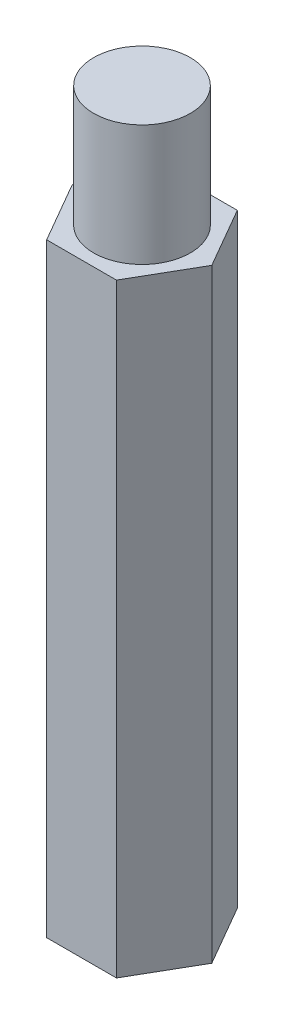
ISO-10303-21;
HEADER;
FILE_DESCRIPTION(('STEP AP214'),'2;1');
FILE_NAME('part.step','',(''),(''),'','','');
FILE_SCHEMA(('AUTOMOTIVE_DESIGN { 1 0 10303 214 1 1 1 1 }'));
ENDSEC;
DATA;
#1=APPLICATION_CONTEXT('core data for automotive mechanical design processes');
#2=APPLICATION_PROTOCOL_DEFINITION('international standard','automotive_design',2000,#1);
#3=PRODUCT_CONTEXT('',#1,'mechanical');
#4=PRODUCT('Part','Part','',(#3));
#5=PRODUCT_RELATED_PRODUCT_CATEGORY('part','',(#4));
#6=PRODUCT_DEFINITION_FORMATION('','',#4);
#7=PRODUCT_DEFINITION_CONTEXT('part definition',#1,'design');
#8=PRODUCT_DEFINITION('design','',#6,#7);
#9=PRODUCT_DEFINITION_SHAPE('','',#8);
#10=(LENGTH_UNIT() NAMED_UNIT(*) SI_UNIT(.MILLI.,.METRE.));
#11=(NAMED_UNIT(*) PLANE_ANGLE_UNIT() SI_UNIT($,.RADIAN.));
#12=(NAMED_UNIT(*) SI_UNIT($,.STERADIAN.) SOLID_ANGLE_UNIT());
#13=UNCERTAINTY_MEASURE_WITH_UNIT(LENGTH_MEASURE(1.E-05),#10,'distance_accuracy_value','');
#14=(GEOMETRIC_REPRESENTATION_CONTEXT(3) GLOBAL_UNCERTAINTY_ASSIGNED_CONTEXT((#13)) GLOBAL_UNIT_ASSIGNED_CONTEXT((#10,
#11,#12)) REPRESENTATION_CONTEXT('',''));
#15=CARTESIAN_POINT('',(0.,0.,0.));
#16=DIRECTION('',(0.,0.,1.));
#17=DIRECTION('',(1.,0.,0.));
#18=AXIS2_PLACEMENT_3D('',#15,#16,#17);
#19=CARTESIAN_POINT('',(2.3094010767585,20.,0.));
#20=DIRECTION('',(-0.866025403784438,0.,0.5));
#21=DIRECTION('',(0.5,0.,0.866025403784439));
#22=AXIS2_PLACEMENT_3D('',#19,#20,#21);
#23=PLANE('',#22);
#24=DIRECTION('',(-0.5,0.,-0.866025403784439));
#25=VECTOR('',#24,1.);
#26=CARTESIAN_POINT('',(2.3094010767585,0.,0.));
#27=LINE('',#26,#25);
#28=CARTESIAN_POINT('',(2.3094010767585,0.,0.));
#29=VERTEX_POINT('',#28);
#30=CARTESIAN_POINT('',(1.15470053837925,0.,-2.));
#31=VERTEX_POINT('',#30);
#32=EDGE_CURVE('E130',#29,#31,#27,.T.);
#33=ORIENTED_EDGE('',*,*,#32,.T.);
#34=DIRECTION('',(0.,-1.,0.));
#35=VECTOR('',#34,1.);
#36=CARTESIAN_POINT('',(1.15470053837925,20.,-2.));
#37=LINE('',#36,#35);
#38=CARTESIAN_POINT('',(1.15470053837925,20.,-2.));
#39=VERTEX_POINT('',#38);
#40=EDGE_CURVE('E42',#39,#31,#37,.T.);
#41=ORIENTED_EDGE('',*,*,#40,.F.);
#42=DIRECTION('',(-0.5,0.,-0.866025403784439));
#43=VECTOR('',#42,1.);
#44=CARTESIAN_POINT('',(2.3094010767585,20.,0.));
#45=LINE('',#44,#43);
#46=CARTESIAN_POINT('',(2.3094010767585,20.,0.));
#47=VERTEX_POINT('',#46);
#48=EDGE_CURVE('E147',#47,#39,#45,.T.);
#49=ORIENTED_EDGE('',*,*,#48,.F.);
#50=DIRECTION('',(0.,-1.,0.));
#51=VECTOR('',#50,1.);
#52=CARTESIAN_POINT('',(2.3094010767585,20.,0.));
#53=LINE('',#52,#51);
#54=EDGE_CURVE('E126',#47,#29,#53,.T.);
#55=ORIENTED_EDGE('',*,*,#54,.T.);
#56=EDGE_LOOP('',(#33,#41,#49,#55));
#57=FACE_BOUND('',#56,.T.);
#58=ADVANCED_FACE('F39',(#57),#23,.F.);
#59=CARTESIAN_POINT('',(1.15470053837925,20.,-2.));
#60=DIRECTION('',(0.,0.,1.));
#61=DIRECTION('',(1.,0.,0.));
#62=AXIS2_PLACEMENT_3D('',#59,#60,#61);
#63=PLANE('',#62);
#64=DIRECTION('',(-1.,0.,0.));
#65=VECTOR('',#64,1.);
#66=CARTESIAN_POINT('',(1.15470053837925,0.,-2.));
#67=LINE('',#66,#65);
#68=CARTESIAN_POINT('',(-1.15470053837925,0.,-2.));
#69=VERTEX_POINT('',#68);
#70=EDGE_CURVE('E134',#31,#69,#67,.T.);
#71=ORIENTED_EDGE('',*,*,#70,.T.);
#72=DIRECTION('',(0.,-1.,0.));
#73=VECTOR('',#72,1.);
#74=CARTESIAN_POINT('',(-1.15470053837925,20.,-2.));
#75=LINE('',#74,#73);
#76=CARTESIAN_POINT('',(-1.15470053837925,20.,-2.));
#77=VERTEX_POINT('',#76);
#78=EDGE_CURVE('E153',#77,#69,#75,.T.);
#79=ORIENTED_EDGE('',*,*,#78,.F.);
#80=DIRECTION('',(-1.,0.,0.));
#81=VECTOR('',#80,1.);
#82=CARTESIAN_POINT('',(1.15470053837925,20.,-2.));
#83=LINE('',#82,#81);
#84=EDGE_CURVE('E95',#39,#77,#83,.T.);
#85=ORIENTED_EDGE('',*,*,#84,.F.);
#86=ORIENTED_EDGE('',*,*,#40,.T.);
#87=EDGE_LOOP('',(#71,#79,#85,#86));
#88=FACE_BOUND('',#87,.T.);
#89=ADVANCED_FACE('F160',(#88),#63,.F.);
#90=CARTESIAN_POINT('',(-1.15470053837925,20.,-2.));
#91=DIRECTION('',(0.866025403784439,0.,0.5));
#92=DIRECTION('',(0.5,0.,-0.866025403784439));
#93=AXIS2_PLACEMENT_3D('',#90,#91,#92);
#94=PLANE('',#93);
#95=DIRECTION('',(-0.499999999999999,0.,0.866025403784439));
#96=VECTOR('',#95,1.);
#97=CARTESIAN_POINT('',(-1.15470053837925,0.,-2.));
#98=LINE('',#97,#96);
#99=CARTESIAN_POINT('',(-2.3094010767585,0.,0.));
#100=VERTEX_POINT('',#99);
#101=EDGE_CURVE('E138',#69,#100,#98,.T.);
#102=ORIENTED_EDGE('',*,*,#101,.T.);
#103=DIRECTION('',(0.,-1.,0.));
#104=VECTOR('',#103,1.);
#105=CARTESIAN_POINT('',(-2.3094010767585,20.,0.));
#106=LINE('',#105,#104);
#107=CARTESIAN_POINT('',(-2.3094010767585,20.,0.));
#108=VERTEX_POINT('',#107);
#109=EDGE_CURVE('E119',#108,#100,#106,.T.);
#110=ORIENTED_EDGE('',*,*,#109,.F.);
#111=DIRECTION('',(-0.499999999999999,0.,0.866025403784439));
#112=VECTOR('',#111,1.);
#113=CARTESIAN_POINT('',(-1.15470053837925,20.,-2.));
#114=LINE('',#113,#112);
#115=EDGE_CURVE('E108',#77,#108,#114,.T.);
#116=ORIENTED_EDGE('',*,*,#115,.F.);
#117=ORIENTED_EDGE('',*,*,#78,.T.);
#118=EDGE_LOOP('',(#102,#110,#116,#117));
#119=FACE_BOUND('',#118,.T.);
#120=ADVANCED_FACE('F166',(#119),#94,.F.);
#121=CARTESIAN_POINT('',(-2.3094010767585,20.,0.));
#122=DIRECTION('',(0.866025403784438,0.,-0.5));
#123=DIRECTION('',(-0.5,0.,-0.866025403784439));
#124=AXIS2_PLACEMENT_3D('',#121,#122,#123);
#125=PLANE('',#124);
#126=DIRECTION('',(0.5,0.,0.866025403784439));
#127=VECTOR('',#126,1.);
#128=CARTESIAN_POINT('',(-2.3094010767585,0.,0.));
#129=LINE('',#128,#127);
#130=CARTESIAN_POINT('',(-1.15470053837925,0.,2.));
#131=VERTEX_POINT('',#130);
#132=EDGE_CURVE('E117',#100,#131,#129,.T.);
#133=ORIENTED_EDGE('',*,*,#132,.T.);
#134=DIRECTION('',(0.,-1.,0.));
#135=VECTOR('',#134,1.);
#136=CARTESIAN_POINT('',(-1.15470053837925,20.,2.));
#137=LINE('',#136,#135);
#138=CARTESIAN_POINT('',(-1.15470053837925,20.,2.));
#139=VERTEX_POINT('',#138);
#140=EDGE_CURVE('E114',#139,#131,#137,.T.);
#141=ORIENTED_EDGE('',*,*,#140,.F.);
#142=DIRECTION('',(0.5,0.,0.866025403784439));
#143=VECTOR('',#142,1.);
#144=CARTESIAN_POINT('',(-2.3094010767585,20.,0.));
#145=LINE('',#144,#143);
#146=EDGE_CURVE('E102',#108,#139,#145,.T.);
#147=ORIENTED_EDGE('',*,*,#146,.F.);
#148=ORIENTED_EDGE('',*,*,#109,.T.);
#149=EDGE_LOOP('',(#133,#141,#147,#148));
#150=FACE_BOUND('',#149,.T.);
#151=ADVANCED_FACE('F115',(#150),#125,.F.);
#152=CARTESIAN_POINT('',(-1.15470053837925,20.,2.));
#153=DIRECTION('',(0.,0.,-1.));
#154=DIRECTION('',(-1.,0.,0.));
#155=AXIS2_PLACEMENT_3D('',#152,#153,#154);
#156=PLANE('',#155);
#157=DIRECTION('',(1.,0.,0.));
#158=VECTOR('',#157,1.);
#159=CARTESIAN_POINT('',(-1.15470053837925,0.,2.));
#160=LINE('',#159,#158);
#161=CARTESIAN_POINT('',(1.15470053837925,0.,2.));
#162=VERTEX_POINT('',#161);
#163=EDGE_CURVE('E80',#131,#162,#160,.T.);
#164=ORIENTED_EDGE('',*,*,#163,.T.);
#165=DIRECTION('',(0.,-1.,0.));
#166=VECTOR('',#165,1.);
#167=CARTESIAN_POINT('',(1.15470053837925,20.,2.));
#168=LINE('',#167,#166);
#169=CARTESIAN_POINT('',(1.15470053837925,20.,2.));
#170=VERTEX_POINT('',#169);
#171=EDGE_CURVE('E120',#170,#162,#168,.T.);
#172=ORIENTED_EDGE('',*,*,#171,.F.);
#173=DIRECTION('',(1.,0.,0.));
#174=VECTOR('',#173,1.);
#175=CARTESIAN_POINT('',(-1.15470053837925,20.,2.));
#176=LINE('',#175,#174);
#177=EDGE_CURVE('E106',#139,#170,#176,.T.);
#178=ORIENTED_EDGE('',*,*,#177,.F.);
#179=ORIENTED_EDGE('',*,*,#140,.T.);
#180=EDGE_LOOP('',(#164,#172,#178,#179));
#181=FACE_BOUND('',#180,.T.);
#182=ADVANCED_FACE('F122',(#181),#156,.F.);
#183=CARTESIAN_POINT('',(1.15470053837925,20.,2.));
#184=DIRECTION('',(-0.866025403784439,0.,-0.5));
#185=DIRECTION('',(-0.5,0.,0.866025403784439));
#186=AXIS2_PLACEMENT_3D('',#183,#184,#185);
#187=PLANE('',#186);
#188=DIRECTION('',(0.5,0.,-0.866025403784439));
#189=VECTOR('',#188,1.);
#190=CARTESIAN_POINT('',(1.15470053837925,0.,2.));
#191=LINE('',#190,#189);
#192=EDGE_CURVE('E86',#162,#29,#191,.T.);
#193=ORIENTED_EDGE('',*,*,#192,.T.);
#194=ORIENTED_EDGE('',*,*,#54,.F.);
#195=DIRECTION('',(0.5,0.,-0.866025403784439));
#196=VECTOR('',#195,1.);
#197=CARTESIAN_POINT('',(1.15470053837925,20.,2.));
#198=LINE('',#197,#196);
#199=EDGE_CURVE('E57',#170,#47,#198,.T.);
#200=ORIENTED_EDGE('',*,*,#199,.F.);
#201=ORIENTED_EDGE('',*,*,#171,.T.);
#202=EDGE_LOOP('',(#193,#194,#200,#201));
#203=FACE_BOUND('',#202,.T.);
#204=ADVANCED_FACE('F203',(#203),#187,.F.);
#205=CARTESIAN_POINT('',(0.,20.,0.));
#206=DIRECTION('',(0.,1.,0.));
#207=DIRECTION('',(0.,0.,1.));
#208=AXIS2_PLACEMENT_3D('',#205,#206,#207);
#209=PLANE('',#208);
#210=CARTESIAN_POINT('',(0.,20.,0.));
#211=DIRECTION('',(0.,1.,0.));
#212=DIRECTION('',(0.,0.,1.));
#213=AXIS2_PLACEMENT_3D('',#210,#211,#212);
#214=CIRCLE('',#213,1.6);
#215=CARTESIAN_POINT('',(0.,20.,1.6));
#216=VERTEX_POINT('',#215);
#217=EDGE_CURVE('E11',#216,#216,#214,.T.);
#218=ORIENTED_EDGE('',*,*,#217,.F.);
#219=EDGE_LOOP('',(#218));
#220=FACE_BOUND('',#219,.T.);
#221=ORIENTED_EDGE('',*,*,#48,.T.);
#222=ORIENTED_EDGE('',*,*,#84,.T.);
#223=ORIENTED_EDGE('',*,*,#115,.T.);
#224=ORIENTED_EDGE('',*,*,#146,.T.);
#225=ORIENTED_EDGE('',*,*,#177,.T.);
#226=ORIENTED_EDGE('',*,*,#199,.T.);
#227=EDGE_LOOP('',(#221,#222,#223,#224,#225,#226));
#228=FACE_BOUND('',#227,.T.);
#229=ADVANCED_FACE('F104',(#220,#228),#209,.T.);
#230=CARTESIAN_POINT('',(0.,0.,0.));
#231=DIRECTION('',(0.,1.,0.));
#232=DIRECTION('',(0.,0.,1.));
#233=AXIS2_PLACEMENT_3D('',#230,#231,#232);
#234=PLANE('',#233);
#235=CARTESIAN_POINT('',(0.,0.,0.));
#236=DIRECTION('',(0.,-1.,0.));
#237=DIRECTION('',(0.,0.,-1.));
#238=AXIS2_PLACEMENT_3D('',#235,#236,#237);
#239=CIRCLE('',#238,1.6);
#240=CARTESIAN_POINT('',(0.,0.,-1.6));
#241=VERTEX_POINT('',#240);
#242=EDGE_CURVE('E177',#241,#241,#239,.T.);
#243=ORIENTED_EDGE('',*,*,#242,.F.);
#244=EDGE_LOOP('',(#243));
#245=FACE_BOUND('',#244,.T.);
#246=ORIENTED_EDGE('',*,*,#32,.F.);
#247=ORIENTED_EDGE('',*,*,#192,.F.);
#248=ORIENTED_EDGE('',*,*,#163,.F.);
#249=ORIENTED_EDGE('',*,*,#132,.F.);
#250=ORIENTED_EDGE('',*,*,#101,.F.);
#251=ORIENTED_EDGE('',*,*,#70,.F.);
#252=EDGE_LOOP('',(#246,#247,#248,#249,#250,#251));
#253=FACE_BOUND('',#252,.T.);
#254=ADVANCED_FACE('F165',(#245,#253),#234,.F.);
#255=CARTESIAN_POINT('',(0.,24.,0.));
#256=DIRECTION('',(0.,-1.,0.));
#257=DIRECTION('',(0.,0.,-1.));
#258=AXIS2_PLACEMENT_3D('',#255,#256,#257);
#259=CYLINDRICAL_SURFACE('',#258,1.6);
#260=CARTESIAN_POINT('',(0.,24.,0.));
#261=DIRECTION('',(0.,1.,0.));
#262=DIRECTION('',(0.,0.,1.));
#263=AXIS2_PLACEMENT_3D('',#260,#261,#262);
#264=CIRCLE('',#263,1.6);
#265=CARTESIAN_POINT('',(0.,24.,1.6));
#266=VERTEX_POINT('',#265);
#267=EDGE_CURVE('E135',#266,#266,#264,.T.);
#268=ORIENTED_EDGE('',*,*,#267,.F.);
#269=EDGE_LOOP('',(#268));
#270=FACE_BOUND('',#269,.T.);
#271=ORIENTED_EDGE('',*,*,#217,.T.);
#272=EDGE_LOOP('',(#271));
#273=FACE_BOUND('',#272,.T.);
#274=ADVANCED_FACE('F195',(#270,#273),#259,.T.);
#275=CARTESIAN_POINT('',(0.,24.,0.));
#276=DIRECTION('',(0.,1.,0.));
#277=DIRECTION('',(0.,0.,1.));
#278=AXIS2_PLACEMENT_3D('',#275,#276,#277);
#279=PLANE('',#278);
#280=ORIENTED_EDGE('',*,*,#267,.T.);
#281=EDGE_LOOP('',(#280));
#282=FACE_BOUND('',#281,.T.);
#283=ADVANCED_FACE('F190',(#282),#279,.T.);
#284=CARTESIAN_POINT('',(0.,4.,0.));
#285=DIRECTION('',(0.,-1.,0.));
#286=DIRECTION('',(0.,0.,-1.));
#287=AXIS2_PLACEMENT_3D('',#284,#285,#286);
#288=CYLINDRICAL_SURFACE('',#287,1.6);
#289=CARTESIAN_POINT('',(0.,4.,0.));
#290=DIRECTION('',(0.,-1.,0.));
#291=DIRECTION('',(0.,0.,-1.));
#292=AXIS2_PLACEMENT_3D('',#289,#290,#291);
#293=CIRCLE('',#292,1.6);
#294=CARTESIAN_POINT('',(0.,4.,-1.6));
#295=VERTEX_POINT('',#294);
#296=EDGE_CURVE('E176',#295,#295,#293,.T.);
#297=ORIENTED_EDGE('',*,*,#296,.F.);
#298=EDGE_LOOP('',(#297));
#299=FACE_BOUND('',#298,.T.);
#300=ORIENTED_EDGE('',*,*,#242,.T.);
#301=EDGE_LOOP('',(#300));
#302=FACE_BOUND('',#301,.T.);
#303=ADVANCED_FACE('F187',(#299,#302),#288,.F.);
#304=CARTESIAN_POINT('',(0.,4.,0.));
#305=DIRECTION('',(0.,-1.,0.));
#306=DIRECTION('',(0.,0.,-1.));
#307=AXIS2_PLACEMENT_3D('',#304,#305,#306);
#308=PLANE('',#307);
#309=ORIENTED_EDGE('',*,*,#296,.T.);
#310=EDGE_LOOP('',(#309));
#311=FACE_BOUND('',#310,.T.);
#312=ADVANCED_FACE('F185',(#311),#308,.T.);
#313=CLOSED_SHELL('',(#58,#89,#120,#151,#182,#204,#229,#254,#274,#283,#303,#312));
#314=MANIFOLD_SOLID_BREP('B2',#313);
#315=ADVANCED_BREP_SHAPE_REPRESENTATION('',(#18,#314),#14);
#316=SHAPE_DEFINITION_REPRESENTATION(#9,#315);
ENDSEC;
END-ISO-10303-21;
